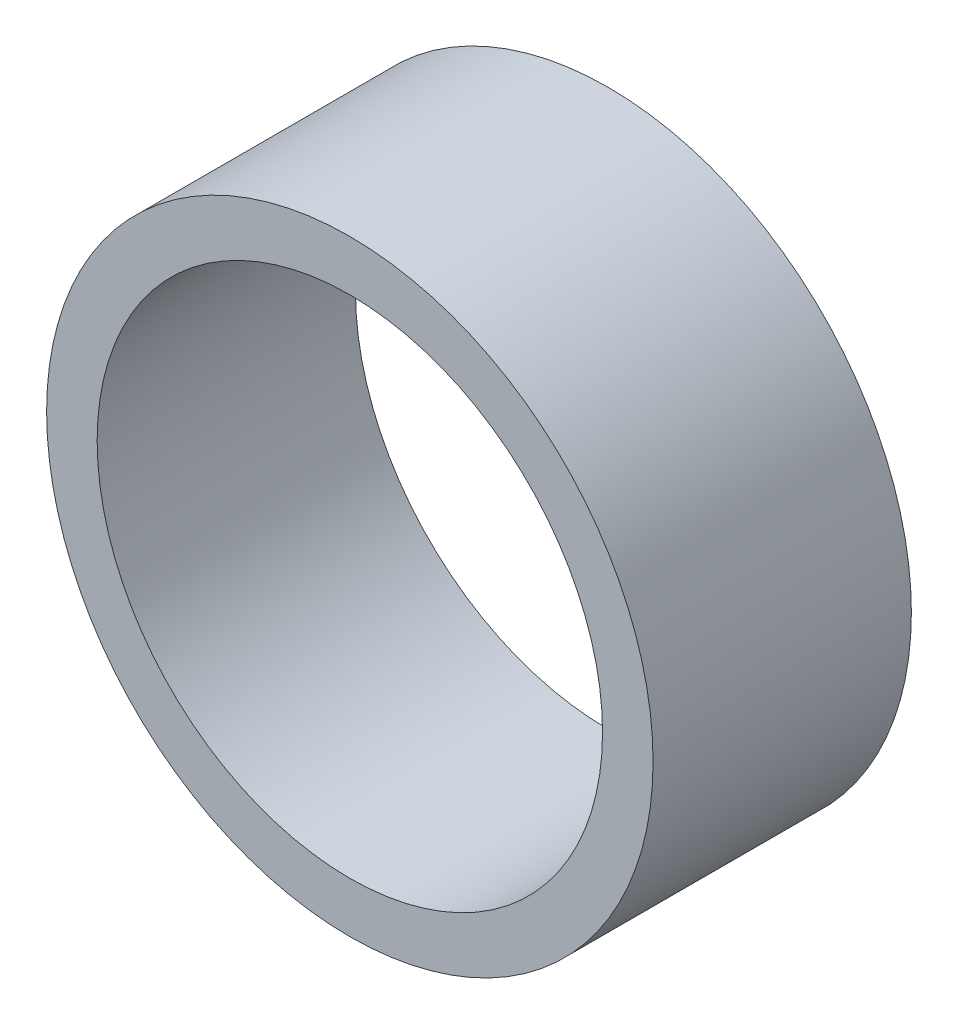
ISO-10303-21;
HEADER;
FILE_DESCRIPTION(('STEP AP214'),'2;1');
FILE_NAME('part.step','',(''),(''),'','','');
FILE_SCHEMA(('AUTOMOTIVE_DESIGN { 1 0 10303 214 1 1 1 1 }'));
ENDSEC;
DATA;
#1=APPLICATION_CONTEXT('core data for automotive mechanical design processes');
#2=APPLICATION_PROTOCOL_DEFINITION('international standard','automotive_design',2000,#1);
#3=PRODUCT_CONTEXT('',#1,'mechanical');
#4=PRODUCT('Part','Part','',(#3));
#5=PRODUCT_RELATED_PRODUCT_CATEGORY('part','',(#4));
#6=PRODUCT_DEFINITION_FORMATION('','',#4);
#7=PRODUCT_DEFINITION_CONTEXT('part definition',#1,'design');
#8=PRODUCT_DEFINITION('design','',#6,#7);
#9=PRODUCT_DEFINITION_SHAPE('','',#8);
#10=(LENGTH_UNIT() NAMED_UNIT(*) SI_UNIT(.MILLI.,.METRE.));
#11=(NAMED_UNIT(*) PLANE_ANGLE_UNIT() SI_UNIT($,.RADIAN.));
#12=(NAMED_UNIT(*) SI_UNIT($,.STERADIAN.) SOLID_ANGLE_UNIT());
#13=UNCERTAINTY_MEASURE_WITH_UNIT(LENGTH_MEASURE(1.E-05),#10,'distance_accuracy_value','');
#14=(GEOMETRIC_REPRESENTATION_CONTEXT(3) GLOBAL_UNCERTAINTY_ASSIGNED_CONTEXT((#13)) GLOBAL_UNIT_ASSIGNED_CONTEXT((#10,
#11,#12)) REPRESENTATION_CONTEXT('',''));
#15=CARTESIAN_POINT('',(0.,0.,0.));
#16=DIRECTION('',(0.,0.,1.));
#17=DIRECTION('',(1.,0.,0.));
#18=AXIS2_PLACEMENT_3D('',#15,#16,#17);
#19=CARTESIAN_POINT('',(0.,0.,23.));
#20=DIRECTION('',(0.,0.,1.));
#21=DIRECTION('',(1.,0.,0.));
#22=AXIS2_PLACEMENT_3D('',#19,#20,#21);
#23=PLANE('',#22);
#24=CARTESIAN_POINT('',(0.,0.,23.));
#25=DIRECTION('',(0.,0.,1.));
#26=DIRECTION('',(1.,0.,0.));
#27=AXIS2_PLACEMENT_3D('',#24,#25,#26);
#28=CIRCLE('',#27,27.);
#29=CARTESIAN_POINT('',(27.,0.,23.));
#30=VERTEX_POINT('',#29);
#31=EDGE_CURVE('E10',#30,#30,#28,.T.);
#32=ORIENTED_EDGE('',*,*,#31,.T.);
#33=EDGE_LOOP('',(#32));
#34=FACE_BOUND('',#33,.T.);
#35=CARTESIAN_POINT('',(0.,0.,23.));
#36=DIRECTION('',(0.,0.,1.));
#37=DIRECTION('',(1.,0.,0.));
#38=AXIS2_PLACEMENT_3D('',#35,#36,#37);
#39=CIRCLE('',#38,22.5);
#40=CARTESIAN_POINT('',(22.5,0.,23.));
#41=VERTEX_POINT('',#40);
#42=EDGE_CURVE('E42',#41,#41,#39,.T.);
#43=ORIENTED_EDGE('',*,*,#42,.F.);
#44=EDGE_LOOP('',(#43));
#45=FACE_BOUND('',#44,.T.);
#46=ADVANCED_FACE('F31',(#34,#45),#23,.T.);
#47=CARTESIAN_POINT('',(0.,0.,0.));
#48=DIRECTION('',(0.,0.,1.));
#49=DIRECTION('',(1.,0.,0.));
#50=AXIS2_PLACEMENT_3D('',#47,#48,#49);
#51=PLANE('',#50);
#52=CARTESIAN_POINT('',(0.,0.,0.));
#53=DIRECTION('',(0.,0.,1.));
#54=DIRECTION('',(1.,0.,0.));
#55=AXIS2_PLACEMENT_3D('',#52,#53,#54);
#56=CIRCLE('',#55,27.);
#57=CARTESIAN_POINT('',(27.,0.,0.));
#58=VERTEX_POINT('',#57);
#59=EDGE_CURVE('E35',#58,#58,#56,.T.);
#60=ORIENTED_EDGE('',*,*,#59,.F.);
#61=EDGE_LOOP('',(#60));
#62=FACE_BOUND('',#61,.T.);
#63=CARTESIAN_POINT('',(0.,0.,0.));
#64=DIRECTION('',(0.,0.,1.));
#65=DIRECTION('',(1.,0.,0.));
#66=AXIS2_PLACEMENT_3D('',#63,#64,#65);
#67=CIRCLE('',#66,22.5);
#68=CARTESIAN_POINT('',(22.5,0.,0.));
#69=VERTEX_POINT('',#68);
#70=EDGE_CURVE('E44',#69,#69,#67,.T.);
#71=ORIENTED_EDGE('',*,*,#70,.T.);
#72=EDGE_LOOP('',(#71));
#73=FACE_BOUND('',#72,.T.);
#74=ADVANCED_FACE('F54',(#62,#73),#51,.F.);
#75=CARTESIAN_POINT('',(0.,0.,23.));
#76=DIRECTION('',(0.,0.,-1.));
#77=DIRECTION('',(-1.,0.,0.));
#78=AXIS2_PLACEMENT_3D('',#75,#76,#77);
#79=CYLINDRICAL_SURFACE('',#78,27.);
#80=ORIENTED_EDGE('',*,*,#31,.F.);
#81=EDGE_LOOP('',(#80));
#82=FACE_BOUND('',#81,.T.);
#83=ORIENTED_EDGE('',*,*,#59,.T.);
#84=EDGE_LOOP('',(#83));
#85=FACE_BOUND('',#84,.T.);
#86=ADVANCED_FACE('F33',(#82,#85),#79,.T.);
#87=CARTESIAN_POINT('',(0.,0.,23.));
#88=DIRECTION('',(0.,0.,-1.));
#89=DIRECTION('',(-1.,0.,0.));
#90=AXIS2_PLACEMENT_3D('',#87,#88,#89);
#91=CYLINDRICAL_SURFACE('',#90,22.5);
#92=ORIENTED_EDGE('',*,*,#42,.T.);
#93=EDGE_LOOP('',(#92));
#94=FACE_BOUND('',#93,.T.);
#95=ORIENTED_EDGE('',*,*,#70,.F.);
#96=EDGE_LOOP('',(#95));
#97=FACE_BOUND('',#96,.T.);
#98=ADVANCED_FACE('F50',(#94,#97),#91,.F.);
#99=CLOSED_SHELL('',(#46,#74,#86,#98));
#100=MANIFOLD_SOLID_BREP('B2',#99);
#101=ADVANCED_BREP_SHAPE_REPRESENTATION('',(#18,#100),#14);
#102=SHAPE_DEFINITION_REPRESENTATION(#9,#101);
ENDSEC;
END-ISO-10303-21;
